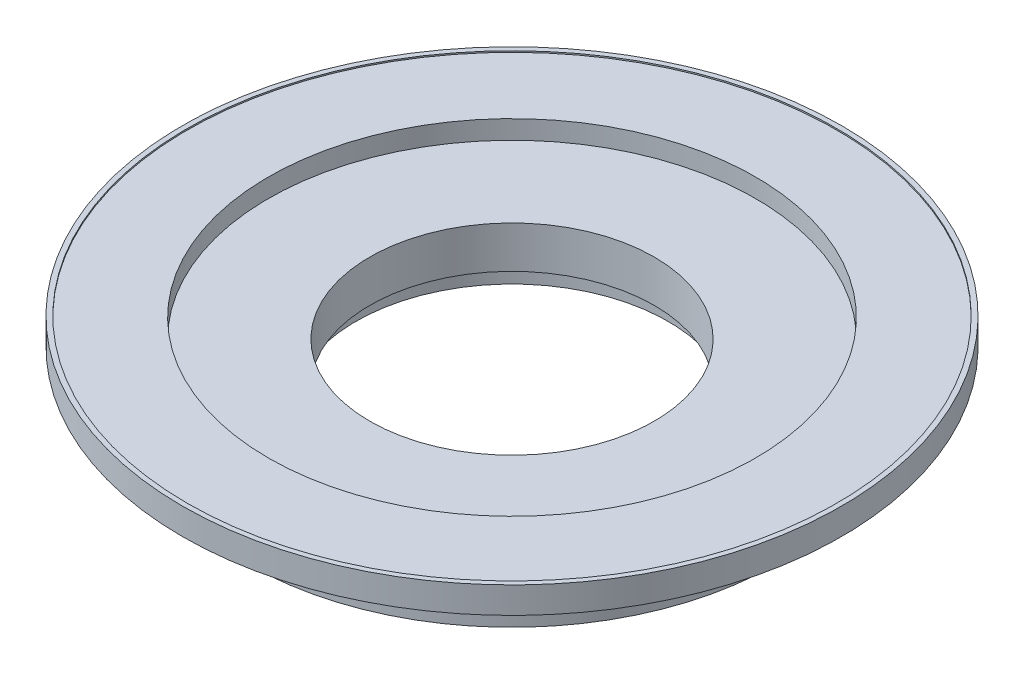
ISO-10303-21;
HEADER;
FILE_DESCRIPTION(('STEP AP214'),'2;1');
FILE_NAME('part.step','',(''),(''),'','','');
FILE_SCHEMA(('AUTOMOTIVE_DESIGN { 1 0 10303 214 1 1 1 1 }'));
ENDSEC;
DATA;
#1=APPLICATION_CONTEXT('core data for automotive mechanical design processes');
#2=APPLICATION_PROTOCOL_DEFINITION('international standard','automotive_design',2000,#1);
#3=PRODUCT_CONTEXT('',#1,'mechanical');
#4=PRODUCT('Part','Part','',(#3));
#5=PRODUCT_RELATED_PRODUCT_CATEGORY('part','',(#4));
#6=PRODUCT_DEFINITION_FORMATION('','',#4);
#7=PRODUCT_DEFINITION_CONTEXT('part definition',#1,'design');
#8=PRODUCT_DEFINITION('design','',#6,#7);
#9=PRODUCT_DEFINITION_SHAPE('','',#8);
#10=(LENGTH_UNIT() NAMED_UNIT(*) SI_UNIT(.MILLI.,.METRE.));
#11=(NAMED_UNIT(*) PLANE_ANGLE_UNIT() SI_UNIT($,.RADIAN.));
#12=(NAMED_UNIT(*) SI_UNIT($,.STERADIAN.) SOLID_ANGLE_UNIT());
#13=UNCERTAINTY_MEASURE_WITH_UNIT(LENGTH_MEASURE(1.E-05),#10,'distance_accuracy_value','');
#14=(GEOMETRIC_REPRESENTATION_CONTEXT(3) GLOBAL_UNCERTAINTY_ASSIGNED_CONTEXT((#13)) GLOBAL_UNIT_ASSIGNED_CONTEXT((#10,
#11,#12)) REPRESENTATION_CONTEXT('',''));
#15=CARTESIAN_POINT('',(0.,0.,0.));
#16=DIRECTION('',(0.,0.,1.));
#17=DIRECTION('',(1.,0.,0.));
#18=AXIS2_PLACEMENT_3D('',#15,#16,#17);
#19=CARTESIAN_POINT('',(0.,-11.938,0.));
#20=DIRECTION('',(0.,1.,0.));
#21=DIRECTION('',(0.,0.,1.));
#22=AXIS2_PLACEMENT_3D('',#19,#20,#21);
#23=PLANE('',#22);
#24=CARTESIAN_POINT('',(0.,-11.938,0.));
#25=DIRECTION('',(0.,1.,0.));
#26=DIRECTION('',(0.,0.,1.));
#27=AXIS2_PLACEMENT_3D('',#24,#25,#26);
#28=CIRCLE('',#27,22.5);
#29=CARTESIAN_POINT('',(0.,-11.938,22.5));
#30=VERTEX_POINT('',#29);
#31=EDGE_CURVE('E50',#30,#30,#28,.T.);
#32=ORIENTED_EDGE('',*,*,#31,.T.);
#33=EDGE_LOOP('',(#32));
#34=FACE_BOUND('',#33,.T.);
#35=CARTESIAN_POINT('',(0.,-11.938,0.));
#36=DIRECTION('',(0.,1.,0.));
#37=DIRECTION('',(0.,0.,1.));
#38=AXIS2_PLACEMENT_3D('',#35,#36,#37);
#39=CIRCLE('',#38,38.1);
#40=CARTESIAN_POINT('',(0.,-11.938,38.1));
#41=VERTEX_POINT('',#40);
#42=EDGE_CURVE('E18',#41,#41,#39,.T.);
#43=ORIENTED_EDGE('',*,*,#42,.F.);
#44=EDGE_LOOP('',(#43));
#45=FACE_BOUND('',#44,.T.);
#46=ADVANCED_FACE('F15',(#34,#45),#23,.F.);
#47=CARTESIAN_POINT('',(0.,0.,0.));
#48=DIRECTION('',(0.,1.,0.));
#49=DIRECTION('',(0.,0.,1.));
#50=AXIS2_PLACEMENT_3D('',#47,#48,#49);
#51=CYLINDRICAL_SURFACE('',#50,38.1);
#52=CARTESIAN_POINT('',(0.,-7.23059226163498,0.));
#53=DIRECTION('',(0.,1.,0.));
#54=DIRECTION('',(0.,0.,-1.));
#55=AXIS2_PLACEMENT_3D('',#52,#53,#54);
#56=CIRCLE('',#55,38.1000000000004);
#57=CARTESIAN_POINT('',(0.,-7.23059226163498,-38.1000000000004));
#58=VERTEX_POINT('',#57);
#59=EDGE_CURVE('E30',#58,#58,#56,.T.);
#60=ORIENTED_EDGE('',*,*,#59,.F.);
#61=EDGE_LOOP('',(#60));
#62=FACE_BOUND('',#61,.T.);
#63=ORIENTED_EDGE('',*,*,#42,.T.);
#64=EDGE_LOOP('',(#63));
#65=FACE_BOUND('',#64,.T.);
#66=ADVANCED_FACE('F58',(#62,#65),#51,.T.);
#67=CARTESIAN_POINT('',(0.,0.,0.));
#68=DIRECTION('',(0.,1.,0.));
#69=DIRECTION('',(0.,0.,1.));
#70=AXIS2_PLACEMENT_3D('',#67,#68,#69);
#71=CYLINDRICAL_SURFACE('',#70,22.5);
#72=ORIENTED_EDGE('',*,*,#31,.F.);
#73=EDGE_LOOP('',(#72));
#74=FACE_BOUND('',#73,.T.);
#75=CARTESIAN_POINT('',(0.,-8.938,0.));
#76=DIRECTION('',(0.,1.,0.));
#77=DIRECTION('',(0.,0.,1.));
#78=AXIS2_PLACEMENT_3D('',#75,#76,#77);
#79=CIRCLE('',#78,22.5);
#80=CARTESIAN_POINT('',(0.,-8.938,22.5));
#81=VERTEX_POINT('',#80);
#82=EDGE_CURVE('E48',#81,#81,#79,.T.);
#83=ORIENTED_EDGE('',*,*,#82,.T.);
#84=EDGE_LOOP('',(#83));
#85=FACE_BOUND('',#84,.T.);
#86=ADVANCED_FACE('F65',(#74,#85),#71,.F.);
#87=CARTESIAN_POINT('',(0.,-3.80999999999902,0.));
#88=DIRECTION('',(0.,1.,0.));
#89=DIRECTION('',(0.,0.,1.));
#90=AXIS2_PLACEMENT_3D('',#87,#88,#89);
#91=CONICAL_SURFACE('',#90,47.4979999999996,1.2217304763958);
#92=CARTESIAN_POINT('',(0.,-3.81,0.));
#93=DIRECTION('',(0.,1.,0.));
#94=DIRECTION('',(0.,0.,1.));
#95=AXIS2_PLACEMENT_3D('',#92,#93,#94);
#96=CIRCLE('',#95,47.498);
#97=CARTESIAN_POINT('',(0.,-3.81,47.498));
#98=VERTEX_POINT('',#97);
#99=EDGE_CURVE('E47',#98,#98,#96,.T.);
#100=ORIENTED_EDGE('',*,*,#99,.F.);
#101=EDGE_LOOP('',(#100));
#102=FACE_BOUND('',#101,.T.);
#103=ORIENTED_EDGE('',*,*,#59,.T.);
#104=EDGE_LOOP('',(#103));
#105=FACE_BOUND('',#104,.T.);
#106=ADVANCED_FACE('F101',(#102,#105),#91,.T.);
#107=CARTESIAN_POINT('',(0.,-8.938,0.));
#108=DIRECTION('',(0.,1.,0.));
#109=DIRECTION('',(0.,0.,1.));
#110=AXIS2_PLACEMENT_3D('',#107,#108,#109);
#111=PLANE('',#110);
#112=CARTESIAN_POINT('',(0.,-8.938,0.));
#113=DIRECTION('',(0.,1.,0.));
#114=DIRECTION('',(0.,0.,1.));
#115=AXIS2_PLACEMENT_3D('',#112,#113,#114);
#116=CIRCLE('',#115,20.5);
#117=CARTESIAN_POINT('',(0.,-8.938,20.5));
#118=VERTEX_POINT('',#117);
#119=EDGE_CURVE('E44',#118,#118,#116,.T.);
#120=ORIENTED_EDGE('',*,*,#119,.T.);
#121=EDGE_LOOP('',(#120));
#122=FACE_BOUND('',#121,.T.);
#123=ORIENTED_EDGE('',*,*,#82,.F.);
#124=EDGE_LOOP('',(#123));
#125=FACE_BOUND('',#124,.T.);
#126=ADVANCED_FACE('F97',(#122,#125),#111,.F.);
#127=CARTESIAN_POINT('',(0.,0.,0.));
#128=DIRECTION('',(0.,1.,0.));
#129=DIRECTION('',(0.,0.,1.));
#130=AXIS2_PLACEMENT_3D('',#127,#128,#129);
#131=CYLINDRICAL_SURFACE('',#130,47.498);
#132=CARTESIAN_POINT('',(0.,0.,0.));
#133=DIRECTION('',(0.,1.,0.));
#134=DIRECTION('',(0.,0.,1.));
#135=AXIS2_PLACEMENT_3D('',#132,#133,#134);
#136=CIRCLE('',#135,47.498);
#137=CARTESIAN_POINT('',(0.,0.,47.498));
#138=VERTEX_POINT('',#137);
#139=EDGE_CURVE('E41',#138,#138,#136,.T.);
#140=ORIENTED_EDGE('',*,*,#139,.F.);
#141=EDGE_LOOP('',(#140));
#142=FACE_BOUND('',#141,.T.);
#143=ORIENTED_EDGE('',*,*,#99,.T.);
#144=EDGE_LOOP('',(#143));
#145=FACE_BOUND('',#144,.T.);
#146=ADVANCED_FACE('F93',(#142,#145),#131,.T.);
#147=CARTESIAN_POINT('',(0.,0.,0.));
#148=DIRECTION('',(0.,1.,0.));
#149=DIRECTION('',(0.,0.,1.));
#150=AXIS2_PLACEMENT_3D('',#147,#148,#149);
#151=CYLINDRICAL_SURFACE('',#150,20.5);
#152=CARTESIAN_POINT('',(0.,-2.9,0.));
#153=DIRECTION('',(0.,1.,0.));
#154=DIRECTION('',(0.,0.,1.));
#155=AXIS2_PLACEMENT_3D('',#152,#153,#154);
#156=CIRCLE('',#155,20.5);
#157=CARTESIAN_POINT('',(0.,-2.9,20.5));
#158=VERTEX_POINT('',#157);
#159=EDGE_CURVE('E38',#158,#158,#156,.F.);
#160=ORIENTED_EDGE('',*,*,#159,.F.);
#161=EDGE_LOOP('',(#160));
#162=FACE_BOUND('',#161,.T.);
#163=ORIENTED_EDGE('',*,*,#119,.F.);
#164=EDGE_LOOP('',(#163));
#165=FACE_BOUND('',#164,.T.);
#166=ADVANCED_FACE('F89',(#162,#165),#151,.F.);
#167=CARTESIAN_POINT('',(0.,0.,0.));
#168=DIRECTION('',(0.,1.,0.));
#169=DIRECTION('',(0.,0.,1.));
#170=AXIS2_PLACEMENT_3D('',#167,#168,#169);
#171=PLANE('',#170);
#172=CARTESIAN_POINT('',(0.,0.,0.));
#173=DIRECTION('',(0.,1.,0.));
#174=DIRECTION('',(0.,0.,1.));
#175=AXIS2_PLACEMENT_3D('',#172,#173,#174);
#176=CIRCLE('',#175,46.798);
#177=CARTESIAN_POINT('',(0.,0.,46.798));
#178=VERTEX_POINT('',#177);
#179=EDGE_CURVE('E35',#178,#178,#176,.F.);
#180=ORIENTED_EDGE('',*,*,#179,.T.);
#181=EDGE_LOOP('',(#180));
#182=FACE_BOUND('',#181,.T.);
#183=ORIENTED_EDGE('',*,*,#139,.T.);
#184=EDGE_LOOP('',(#183));
#185=FACE_BOUND('',#184,.T.);
#186=ADVANCED_FACE('F85',(#182,#185),#171,.T.);
#187=CARTESIAN_POINT('',(0.,-2.9,0.));
#188=DIRECTION('',(0.,1.,0.));
#189=DIRECTION('',(0.,0.,1.));
#190=AXIS2_PLACEMENT_3D('',#187,#188,#189);
#191=PLANE('',#190);
#192=ORIENTED_EDGE('',*,*,#159,.T.);
#193=EDGE_LOOP('',(#192));
#194=FACE_BOUND('',#193,.T.);
#195=CARTESIAN_POINT('',(0.,-2.9,0.));
#196=DIRECTION('',(0.,1.,0.));
#197=DIRECTION('',(0.,0.,1.));
#198=AXIS2_PLACEMENT_3D('',#195,#196,#197);
#199=CIRCLE('',#198,35.1);
#200=CARTESIAN_POINT('',(0.,-2.9,35.1));
#201=VERTEX_POINT('',#200);
#202=EDGE_CURVE('E27',#201,#201,#199,.T.);
#203=ORIENTED_EDGE('',*,*,#202,.T.);
#204=EDGE_LOOP('',(#203));
#205=FACE_BOUND('',#204,.T.);
#206=ADVANCED_FACE('F81',(#194,#205),#191,.T.);
#207=CARTESIAN_POINT('',(0.,0.,0.));
#208=DIRECTION('',(0.,1.,0.));
#209=DIRECTION('',(0.,0.,1.));
#210=AXIS2_PLACEMENT_3D('',#207,#208,#209);
#211=CYLINDRICAL_SURFACE('',#210,46.798);
#212=CARTESIAN_POINT('',(0.,-0.2,0.));
#213=DIRECTION('',(0.,1.,0.));
#214=DIRECTION('',(0.,0.,1.));
#215=AXIS2_PLACEMENT_3D('',#212,#213,#214);
#216=CIRCLE('',#215,46.798);
#217=CARTESIAN_POINT('',(0.,-0.2,46.798));
#218=VERTEX_POINT('',#217);
#219=EDGE_CURVE('E22',#218,#218,#216,.T.);
#220=ORIENTED_EDGE('',*,*,#219,.F.);
#221=EDGE_LOOP('',(#220));
#222=FACE_BOUND('',#221,.T.);
#223=ORIENTED_EDGE('',*,*,#179,.F.);
#224=EDGE_LOOP('',(#223));
#225=FACE_BOUND('',#224,.T.);
#226=ADVANCED_FACE('F74',(#222,#225),#211,.F.);
#227=CARTESIAN_POINT('',(0.,0.,0.));
#228=DIRECTION('',(0.,1.,0.));
#229=DIRECTION('',(0.,0.,1.));
#230=AXIS2_PLACEMENT_3D('',#227,#228,#229);
#231=CYLINDRICAL_SURFACE('',#230,35.1);
#232=CARTESIAN_POINT('',(0.,-0.2,0.));
#233=DIRECTION('',(0.,1.,0.));
#234=DIRECTION('',(0.,0.,1.));
#235=AXIS2_PLACEMENT_3D('',#232,#233,#234);
#236=CIRCLE('',#235,35.1);
#237=CARTESIAN_POINT('',(0.,-0.2,35.1));
#238=VERTEX_POINT('',#237);
#239=EDGE_CURVE('E10',#238,#238,#236,.F.);
#240=ORIENTED_EDGE('',*,*,#239,.F.);
#241=EDGE_LOOP('',(#240));
#242=FACE_BOUND('',#241,.T.);
#243=ORIENTED_EDGE('',*,*,#202,.F.);
#244=EDGE_LOOP('',(#243));
#245=FACE_BOUND('',#244,.T.);
#246=ADVANCED_FACE('F69',(#242,#245),#231,.F.);
#247=CARTESIAN_POINT('',(0.,-0.2,0.));
#248=DIRECTION('',(0.,1.,0.));
#249=DIRECTION('',(0.,0.,1.));
#250=AXIS2_PLACEMENT_3D('',#247,#248,#249);
#251=PLANE('',#250);
#252=ORIENTED_EDGE('',*,*,#239,.T.);
#253=EDGE_LOOP('',(#252));
#254=FACE_BOUND('',#253,.T.);
#255=ORIENTED_EDGE('',*,*,#219,.T.);
#256=EDGE_LOOP('',(#255));
#257=FACE_BOUND('',#256,.T.);
#258=ADVANCED_FACE('F67',(#254,#257),#251,.T.);
#259=CLOSED_SHELL('',(#46,#66,#86,#106,#126,#146,#166,#186,#206,#226,#246,#258));
#260=MANIFOLD_SOLID_BREP('B1',#259);
#261=ADVANCED_BREP_SHAPE_REPRESENTATION('',(#18,#260),#14);
#262=SHAPE_DEFINITION_REPRESENTATION(#9,#261);
ENDSEC;
END-ISO-10303-21;
